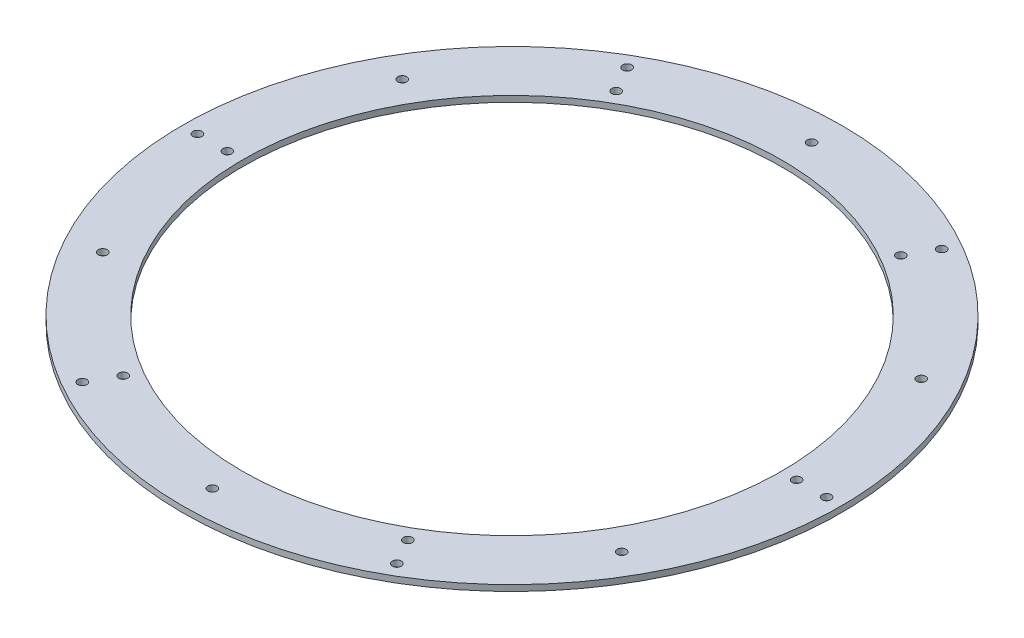
ISO-10303-21;
HEADER;
FILE_DESCRIPTION(('STEP AP214'),'2;1');
FILE_NAME('part.step','',(''),(''),'','','');
FILE_SCHEMA(('AUTOMOTIVE_DESIGN { 1 0 10303 214 1 1 1 1 }'));
ENDSEC;
DATA;
#1=APPLICATION_CONTEXT('core data for automotive mechanical design processes');
#2=APPLICATION_PROTOCOL_DEFINITION('international standard','automotive_design',2000,#1);
#3=PRODUCT_CONTEXT('',#1,'mechanical');
#4=PRODUCT('Part','Part','',(#3));
#5=PRODUCT_RELATED_PRODUCT_CATEGORY('part','',(#4));
#6=PRODUCT_DEFINITION_FORMATION('','',#4);
#7=PRODUCT_DEFINITION_CONTEXT('part definition',#1,'design');
#8=PRODUCT_DEFINITION('design','',#6,#7);
#9=PRODUCT_DEFINITION_SHAPE('','',#8);
#10=(LENGTH_UNIT() NAMED_UNIT(*) SI_UNIT(.MILLI.,.METRE.));
#11=(NAMED_UNIT(*) PLANE_ANGLE_UNIT() SI_UNIT($,.RADIAN.));
#12=(NAMED_UNIT(*) SI_UNIT($,.STERADIAN.) SOLID_ANGLE_UNIT());
#13=UNCERTAINTY_MEASURE_WITH_UNIT(LENGTH_MEASURE(1.E-05),#10,'distance_accuracy_value','');
#14=(GEOMETRIC_REPRESENTATION_CONTEXT(3) GLOBAL_UNCERTAINTY_ASSIGNED_CONTEXT((#13)) GLOBAL_UNIT_ASSIGNED_CONTEXT((#10,
#11,#12)) REPRESENTATION_CONTEXT('',''));
#15=CARTESIAN_POINT('',(0.,0.,0.));
#16=DIRECTION('',(0.,0.,1.));
#17=DIRECTION('',(1.,0.,0.));
#18=AXIS2_PLACEMENT_3D('',#15,#16,#17);
#19=CARTESIAN_POINT('',(0.,2.,0.));
#20=DIRECTION('',(0.,1.,0.));
#21=DIRECTION('',(0.,0.,1.));
#22=AXIS2_PLACEMENT_3D('',#19,#20,#21);
#23=PLANE('',#22);
#24=CARTESIAN_POINT('',(52.5,2.,-90.9326673973661));
#25=DIRECTION('',(0.,1.,0.));
#26=DIRECTION('',(0.,0.,1.));
#27=AXIS2_PLACEMENT_3D('',#24,#25,#26);
#28=CIRCLE('',#27,1.49999999999999);
#29=CARTESIAN_POINT('',(52.5,2.,-89.4326673973661));
#30=VERTEX_POINT('',#29);
#31=EDGE_CURVE('E142',#30,#30,#28,.T.);
#32=ORIENTED_EDGE('',*,*,#31,.F.);
#33=EDGE_LOOP('',(#32));
#34=FACE_BOUND('',#33,.T.);
#35=CARTESIAN_POINT('',(-86.6025403784439,2.,-50.));
#36=DIRECTION('',(0.,1.,0.));
#37=DIRECTION('',(0.,0.,1.));
#38=AXIS2_PLACEMENT_3D('',#35,#36,#37);
#39=CIRCLE('',#38,1.49999999999998);
#40=CARTESIAN_POINT('',(-86.6025403784439,2.,-48.5));
#41=VERTEX_POINT('',#40);
#42=EDGE_CURVE('E130',#41,#41,#39,.T.);
#43=ORIENTED_EDGE('',*,*,#42,.F.);
#44=EDGE_LOOP('',(#43));
#45=FACE_BOUND('',#44,.T.);
#46=CARTESIAN_POINT('',(-47.5,2.,-82.2724133595217));
#47=DIRECTION('',(0.,1.,0.));
#48=DIRECTION('',(0.,0.,1.));
#49=AXIS2_PLACEMENT_3D('',#46,#47,#48);
#50=CIRCLE('',#49,1.5);
#51=CARTESIAN_POINT('',(-47.5,2.,-80.7724133595217));
#52=VERTEX_POINT('',#51);
#53=EDGE_CURVE('E118',#52,#52,#50,.T.);
#54=ORIENTED_EDGE('',*,*,#53,.F.);
#55=EDGE_LOOP('',(#54));
#56=FACE_BOUND('',#55,.T.);
#57=CARTESIAN_POINT('',(-105.,2.,0.));
#58=DIRECTION('',(0.,1.,0.));
#59=DIRECTION('',(0.,0.,1.));
#60=AXIS2_PLACEMENT_3D('',#57,#58,#59);
#61=CIRCLE('',#60,1.49999999999998);
#62=CARTESIAN_POINT('',(-105.,2.,1.49999999999998));
#63=VERTEX_POINT('',#62);
#64=EDGE_CURVE('E106',#63,#63,#61,.T.);
#65=ORIENTED_EDGE('',*,*,#64,.F.);
#66=EDGE_LOOP('',(#65));
#67=FACE_BOUND('',#66,.T.);
#68=CARTESIAN_POINT('',(0.,2.,100.));
#69=DIRECTION('',(0.,1.,0.));
#70=DIRECTION('',(0.,0.,1.));
#71=AXIS2_PLACEMENT_3D('',#68,#69,#70);
#72=CIRCLE('',#71,1.5);
#73=CARTESIAN_POINT('',(0.,2.,101.5));
#74=VERTEX_POINT('',#73);
#75=EDGE_CURVE('E94',#74,#74,#72,.T.);
#76=ORIENTED_EDGE('',*,*,#75,.F.);
#77=EDGE_LOOP('',(#76));
#78=FACE_BOUND('',#77,.T.);
#79=CARTESIAN_POINT('',(-47.5,2.,82.2724133595217));
#80=DIRECTION('',(0.,1.,0.));
#81=DIRECTION('',(0.,0.,1.));
#82=AXIS2_PLACEMENT_3D('',#79,#80,#81);
#83=CIRCLE('',#82,1.5);
#84=CARTESIAN_POINT('',(-47.5,2.,83.7724133595217));
#85=VERTEX_POINT('',#84);
#86=EDGE_CURVE('E82',#85,#85,#83,.T.);
#87=ORIENTED_EDGE('',*,*,#86,.F.);
#88=EDGE_LOOP('',(#87));
#89=FACE_BOUND('',#88,.T.);
#90=CARTESIAN_POINT('',(52.5,2.,90.932667397366));
#91=DIRECTION('',(0.,1.,0.));
#92=DIRECTION('',(0.,0.,1.));
#93=AXIS2_PLACEMENT_3D('',#90,#91,#92);
#94=CIRCLE('',#93,1.5);
#95=CARTESIAN_POINT('',(52.5,2.,92.432667397366));
#96=VERTEX_POINT('',#95);
#97=EDGE_CURVE('E70',#96,#96,#94,.T.);
#98=ORIENTED_EDGE('',*,*,#97,.F.);
#99=EDGE_LOOP('',(#98));
#100=FACE_BOUND('',#99,.T.);
#101=CARTESIAN_POINT('',(86.6025403784439,2.,-50.));
#102=DIRECTION('',(0.,1.,0.));
#103=DIRECTION('',(0.,0.,1.));
#104=AXIS2_PLACEMENT_3D('',#101,#102,#103);
#105=CIRCLE('',#104,1.5);
#106=CARTESIAN_POINT('',(86.6025403784439,2.,-48.5));
#107=VERTEX_POINT('',#106);
#108=EDGE_CURVE('E58',#107,#107,#105,.T.);
#109=ORIENTED_EDGE('',*,*,#108,.F.);
#110=EDGE_LOOP('',(#109));
#111=FACE_BOUND('',#110,.T.);
#112=CARTESIAN_POINT('',(95.,2.,0.));
#113=DIRECTION('',(0.,1.,0.));
#114=DIRECTION('',(0.,0.,1.));
#115=AXIS2_PLACEMENT_3D('',#112,#113,#114);
#116=CIRCLE('',#115,1.5);
#117=CARTESIAN_POINT('',(95.,2.,1.5));
#118=VERTEX_POINT('',#117);
#119=EDGE_CURVE('E46',#118,#118,#116,.T.);
#120=ORIENTED_EDGE('',*,*,#119,.F.);
#121=EDGE_LOOP('',(#120));
#122=FACE_BOUND('',#121,.T.);
#123=CARTESIAN_POINT('',(0.,2.,0.));
#124=DIRECTION('',(0.,1.,0.));
#125=DIRECTION('',(0.,0.,1.));
#126=AXIS2_PLACEMENT_3D('',#123,#124,#125);
#127=CIRCLE('',#126,110.);
#128=CARTESIAN_POINT('',(0.,2.,110.));
#129=VERTEX_POINT('',#128);
#130=EDGE_CURVE('E10',#129,#129,#127,.T.);
#131=ORIENTED_EDGE('',*,*,#130,.T.);
#132=EDGE_LOOP('',(#131));
#133=FACE_BOUND('',#132,.T.);
#134=CARTESIAN_POINT('',(0.,2.,0.));
#135=DIRECTION('',(0.,1.,0.));
#136=DIRECTION('',(0.,0.,1.));
#137=AXIS2_PLACEMENT_3D('',#134,#135,#136);
#138=CIRCLE('',#137,90.);
#139=CARTESIAN_POINT('',(0.,2.,90.));
#140=VERTEX_POINT('',#139);
#141=EDGE_CURVE('E41',#140,#140,#138,.T.);
#142=ORIENTED_EDGE('',*,*,#141,.F.);
#143=EDGE_LOOP('',(#142));
#144=FACE_BOUND('',#143,.T.);
#145=CARTESIAN_POINT('',(105.,2.,0.));
#146=DIRECTION('',(0.,1.,0.));
#147=DIRECTION('',(0.,0.,1.));
#148=AXIS2_PLACEMENT_3D('',#145,#146,#147);
#149=CIRCLE('',#148,1.5);
#150=CARTESIAN_POINT('',(105.,2.,1.5));
#151=VERTEX_POINT('',#150);
#152=EDGE_CURVE('E52',#151,#151,#149,.T.);
#153=ORIENTED_EDGE('',*,*,#152,.F.);
#154=EDGE_LOOP('',(#153));
#155=FACE_BOUND('',#154,.T.);
#156=CARTESIAN_POINT('',(47.5,2.,82.2724133595217));
#157=DIRECTION('',(0.,1.,0.));
#158=DIRECTION('',(0.,0.,1.));
#159=AXIS2_PLACEMENT_3D('',#156,#157,#158);
#160=CIRCLE('',#159,1.5);
#161=CARTESIAN_POINT('',(47.5,2.,83.7724133595217));
#162=VERTEX_POINT('',#161);
#163=EDGE_CURVE('E64',#162,#162,#160,.T.);
#164=ORIENTED_EDGE('',*,*,#163,.F.);
#165=EDGE_LOOP('',(#164));
#166=FACE_BOUND('',#165,.T.);
#167=CARTESIAN_POINT('',(86.6025403784439,2.,50.));
#168=DIRECTION('',(0.,1.,0.));
#169=DIRECTION('',(0.,0.,1.));
#170=AXIS2_PLACEMENT_3D('',#167,#168,#169);
#171=CIRCLE('',#170,1.5);
#172=CARTESIAN_POINT('',(86.6025403784439,2.,51.5));
#173=VERTEX_POINT('',#172);
#174=EDGE_CURVE('E76',#173,#173,#171,.T.);
#175=ORIENTED_EDGE('',*,*,#174,.F.);
#176=EDGE_LOOP('',(#175));
#177=FACE_BOUND('',#176,.T.);
#178=CARTESIAN_POINT('',(-52.5,2.,90.932667397366));
#179=DIRECTION('',(0.,1.,0.));
#180=DIRECTION('',(0.,0.,1.));
#181=AXIS2_PLACEMENT_3D('',#178,#179,#180);
#182=CIRCLE('',#181,1.49999999999999);
#183=CARTESIAN_POINT('',(-52.5,2.,92.432667397366));
#184=VERTEX_POINT('',#183);
#185=EDGE_CURVE('E88',#184,#184,#182,.T.);
#186=ORIENTED_EDGE('',*,*,#185,.F.);
#187=EDGE_LOOP('',(#186));
#188=FACE_BOUND('',#187,.T.);
#189=CARTESIAN_POINT('',(-95.,2.,0.));
#190=DIRECTION('',(0.,1.,0.));
#191=DIRECTION('',(0.,0.,1.));
#192=AXIS2_PLACEMENT_3D('',#189,#190,#191);
#193=CIRCLE('',#192,1.5);
#194=CARTESIAN_POINT('',(-95.,2.,1.49999999999999));
#195=VERTEX_POINT('',#194);
#196=EDGE_CURVE('E100',#195,#195,#193,.T.);
#197=ORIENTED_EDGE('',*,*,#196,.F.);
#198=EDGE_LOOP('',(#197));
#199=FACE_BOUND('',#198,.T.);
#200=CARTESIAN_POINT('',(-86.6025403784439,2.,50.));
#201=DIRECTION('',(0.,1.,0.));
#202=DIRECTION('',(0.,0.,1.));
#203=AXIS2_PLACEMENT_3D('',#200,#201,#202);
#204=CIRCLE('',#203,1.49999999999998);
#205=CARTESIAN_POINT('',(-86.6025403784439,2.,51.5));
#206=VERTEX_POINT('',#205);
#207=EDGE_CURVE('E112',#206,#206,#204,.T.);
#208=ORIENTED_EDGE('',*,*,#207,.F.);
#209=EDGE_LOOP('',(#208));
#210=FACE_BOUND('',#209,.T.);
#211=CARTESIAN_POINT('',(-52.5,2.,-90.932667397366));
#212=DIRECTION('',(0.,1.,0.));
#213=DIRECTION('',(0.,0.,1.));
#214=AXIS2_PLACEMENT_3D('',#211,#212,#213);
#215=CIRCLE('',#214,1.5);
#216=CARTESIAN_POINT('',(-52.5,2.,-89.432667397366));
#217=VERTEX_POINT('',#216);
#218=EDGE_CURVE('E124',#217,#217,#215,.T.);
#219=ORIENTED_EDGE('',*,*,#218,.F.);
#220=EDGE_LOOP('',(#219));
#221=FACE_BOUND('',#220,.T.);
#222=CARTESIAN_POINT('',(47.5,2.,-82.2724133595217));
#223=DIRECTION('',(0.,1.,0.));
#224=DIRECTION('',(0.,0.,1.));
#225=AXIS2_PLACEMENT_3D('',#222,#223,#224);
#226=CIRCLE('',#225,1.5);
#227=CARTESIAN_POINT('',(47.5,2.,-80.7724133595217));
#228=VERTEX_POINT('',#227);
#229=EDGE_CURVE('E136',#228,#228,#226,.T.);
#230=ORIENTED_EDGE('',*,*,#229,.F.);
#231=EDGE_LOOP('',(#230));
#232=FACE_BOUND('',#231,.T.);
#233=CARTESIAN_POINT('',(0.,2.,-100.));
#234=DIRECTION('',(0.,1.,0.));
#235=DIRECTION('',(0.,0.,1.));
#236=AXIS2_PLACEMENT_3D('',#233,#234,#235);
#237=CIRCLE('',#236,1.5);
#238=CARTESIAN_POINT('',(0.,2.,-98.5));
#239=VERTEX_POINT('',#238);
#240=EDGE_CURVE('E148',#239,#239,#237,.T.);
#241=ORIENTED_EDGE('',*,*,#240,.F.);
#242=EDGE_LOOP('',(#241));
#243=FACE_BOUND('',#242,.T.);
#244=ADVANCED_FACE('F30',(#34,#45,#56,#67,#78,#89,#100,#111,#122,#133,#144,#155,#166,#177,#188,
#199,#210,#221,#232,#243),#23,.T.);
#245=CARTESIAN_POINT('',(0.,0.,0.));
#246=DIRECTION('',(0.,1.,0.));
#247=DIRECTION('',(0.,0.,1.));
#248=AXIS2_PLACEMENT_3D('',#245,#246,#247);
#249=PLANE('',#248);
#250=CARTESIAN_POINT('',(0.,0.,0.));
#251=DIRECTION('',(0.,1.,0.));
#252=DIRECTION('',(0.,0.,1.));
#253=AXIS2_PLACEMENT_3D('',#250,#251,#252);
#254=CIRCLE('',#253,110.);
#255=CARTESIAN_POINT('',(0.,0.,110.));
#256=VERTEX_POINT('',#255);
#257=EDGE_CURVE('E34',#256,#256,#254,.T.);
#258=ORIENTED_EDGE('',*,*,#257,.F.);
#259=EDGE_LOOP('',(#258));
#260=FACE_BOUND('',#259,.T.);
#261=CARTESIAN_POINT('',(0.,0.,0.));
#262=DIRECTION('',(0.,1.,0.));
#263=DIRECTION('',(0.,0.,1.));
#264=AXIS2_PLACEMENT_3D('',#261,#262,#263);
#265=CIRCLE('',#264,90.);
#266=CARTESIAN_POINT('',(0.,0.,90.));
#267=VERTEX_POINT('',#266);
#268=EDGE_CURVE('E43',#267,#267,#265,.T.);
#269=ORIENTED_EDGE('',*,*,#268,.T.);
#270=EDGE_LOOP('',(#269));
#271=FACE_BOUND('',#270,.T.);
#272=CARTESIAN_POINT('',(95.,0.,0.));
#273=DIRECTION('',(0.,1.,0.));
#274=DIRECTION('',(0.,0.,1.));
#275=AXIS2_PLACEMENT_3D('',#272,#273,#274);
#276=CIRCLE('',#275,1.5);
#277=CARTESIAN_POINT('',(95.,0.,1.5));
#278=VERTEX_POINT('',#277);
#279=EDGE_CURVE('E49',#278,#278,#276,.T.);
#280=ORIENTED_EDGE('',*,*,#279,.T.);
#281=EDGE_LOOP('',(#280));
#282=FACE_BOUND('',#281,.T.);
#283=CARTESIAN_POINT('',(105.,0.,0.));
#284=DIRECTION('',(0.,1.,0.));
#285=DIRECTION('',(0.,0.,1.));
#286=AXIS2_PLACEMENT_3D('',#283,#284,#285);
#287=CIRCLE('',#286,1.5);
#288=CARTESIAN_POINT('',(105.,0.,1.5));
#289=VERTEX_POINT('',#288);
#290=EDGE_CURVE('E55',#289,#289,#287,.T.);
#291=ORIENTED_EDGE('',*,*,#290,.T.);
#292=EDGE_LOOP('',(#291));
#293=FACE_BOUND('',#292,.T.);
#294=CARTESIAN_POINT('',(86.6025403784439,0.,-50.));
#295=DIRECTION('',(0.,1.,0.));
#296=DIRECTION('',(0.,0.,1.));
#297=AXIS2_PLACEMENT_3D('',#294,#295,#296);
#298=CIRCLE('',#297,1.5);
#299=CARTESIAN_POINT('',(86.6025403784439,0.,-48.5));
#300=VERTEX_POINT('',#299);
#301=EDGE_CURVE('E61',#300,#300,#298,.T.);
#302=ORIENTED_EDGE('',*,*,#301,.T.);
#303=EDGE_LOOP('',(#302));
#304=FACE_BOUND('',#303,.T.);
#305=CARTESIAN_POINT('',(47.5,0.,82.2724133595217));
#306=DIRECTION('',(0.,1.,0.));
#307=DIRECTION('',(0.,0.,1.));
#308=AXIS2_PLACEMENT_3D('',#305,#306,#307);
#309=CIRCLE('',#308,1.5);
#310=CARTESIAN_POINT('',(47.5,0.,83.7724133595217));
#311=VERTEX_POINT('',#310);
#312=EDGE_CURVE('E67',#311,#311,#309,.T.);
#313=ORIENTED_EDGE('',*,*,#312,.T.);
#314=EDGE_LOOP('',(#313));
#315=FACE_BOUND('',#314,.T.);
#316=CARTESIAN_POINT('',(52.5,0.,90.932667397366));
#317=DIRECTION('',(0.,1.,0.));
#318=DIRECTION('',(0.,0.,1.));
#319=AXIS2_PLACEMENT_3D('',#316,#317,#318);
#320=CIRCLE('',#319,1.5);
#321=CARTESIAN_POINT('',(52.5,0.,92.432667397366));
#322=VERTEX_POINT('',#321);
#323=EDGE_CURVE('E73',#322,#322,#320,.T.);
#324=ORIENTED_EDGE('',*,*,#323,.T.);
#325=EDGE_LOOP('',(#324));
#326=FACE_BOUND('',#325,.T.);
#327=CARTESIAN_POINT('',(86.6025403784439,0.,50.));
#328=DIRECTION('',(0.,1.,0.));
#329=DIRECTION('',(0.,0.,1.));
#330=AXIS2_PLACEMENT_3D('',#327,#328,#329);
#331=CIRCLE('',#330,1.5);
#332=CARTESIAN_POINT('',(86.6025403784439,0.,51.5));
#333=VERTEX_POINT('',#332);
#334=EDGE_CURVE('E79',#333,#333,#331,.T.);
#335=ORIENTED_EDGE('',*,*,#334,.T.);
#336=EDGE_LOOP('',(#335));
#337=FACE_BOUND('',#336,.T.);
#338=CARTESIAN_POINT('',(-47.5,0.,82.2724133595217));
#339=DIRECTION('',(0.,1.,0.));
#340=DIRECTION('',(0.,0.,1.));
#341=AXIS2_PLACEMENT_3D('',#338,#339,#340);
#342=CIRCLE('',#341,1.5);
#343=CARTESIAN_POINT('',(-47.5,0.,83.7724133595217));
#344=VERTEX_POINT('',#343);
#345=EDGE_CURVE('E85',#344,#344,#342,.T.);
#346=ORIENTED_EDGE('',*,*,#345,.T.);
#347=EDGE_LOOP('',(#346));
#348=FACE_BOUND('',#347,.T.);
#349=CARTESIAN_POINT('',(-52.5,0.,90.932667397366));
#350=DIRECTION('',(0.,1.,0.));
#351=DIRECTION('',(0.,0.,1.));
#352=AXIS2_PLACEMENT_3D('',#349,#350,#351);
#353=CIRCLE('',#352,1.49999999999999);
#354=CARTESIAN_POINT('',(-52.5,0.,92.432667397366));
#355=VERTEX_POINT('',#354);
#356=EDGE_CURVE('E91',#355,#355,#353,.T.);
#357=ORIENTED_EDGE('',*,*,#356,.T.);
#358=EDGE_LOOP('',(#357));
#359=FACE_BOUND('',#358,.T.);
#360=CARTESIAN_POINT('',(0.,0.,100.));
#361=DIRECTION('',(0.,1.,0.));
#362=DIRECTION('',(0.,0.,1.));
#363=AXIS2_PLACEMENT_3D('',#360,#361,#362);
#364=CIRCLE('',#363,1.5);
#365=CARTESIAN_POINT('',(0.,0.,101.5));
#366=VERTEX_POINT('',#365);
#367=EDGE_CURVE('E97',#366,#366,#364,.T.);
#368=ORIENTED_EDGE('',*,*,#367,.T.);
#369=EDGE_LOOP('',(#368));
#370=FACE_BOUND('',#369,.T.);
#371=CARTESIAN_POINT('',(-95.,0.,0.));
#372=DIRECTION('',(0.,1.,0.));
#373=DIRECTION('',(0.,0.,1.));
#374=AXIS2_PLACEMENT_3D('',#371,#372,#373);
#375=CIRCLE('',#374,1.5);
#376=CARTESIAN_POINT('',(-95.,0.,1.49999999999999));
#377=VERTEX_POINT('',#376);
#378=EDGE_CURVE('E103',#377,#377,#375,.T.);
#379=ORIENTED_EDGE('',*,*,#378,.T.);
#380=EDGE_LOOP('',(#379));
#381=FACE_BOUND('',#380,.T.);
#382=CARTESIAN_POINT('',(-105.,0.,0.));
#383=DIRECTION('',(0.,1.,0.));
#384=DIRECTION('',(0.,0.,1.));
#385=AXIS2_PLACEMENT_3D('',#382,#383,#384);
#386=CIRCLE('',#385,1.49999999999998);
#387=CARTESIAN_POINT('',(-105.,0.,1.49999999999998));
#388=VERTEX_POINT('',#387);
#389=EDGE_CURVE('E109',#388,#388,#386,.T.);
#390=ORIENTED_EDGE('',*,*,#389,.T.);
#391=EDGE_LOOP('',(#390));
#392=FACE_BOUND('',#391,.T.);
#393=CARTESIAN_POINT('',(-86.6025403784439,0.,50.));
#394=DIRECTION('',(0.,1.,0.));
#395=DIRECTION('',(0.,0.,1.));
#396=AXIS2_PLACEMENT_3D('',#393,#394,#395);
#397=CIRCLE('',#396,1.49999999999998);
#398=CARTESIAN_POINT('',(-86.6025403784439,0.,51.5));
#399=VERTEX_POINT('',#398);
#400=EDGE_CURVE('E115',#399,#399,#397,.T.);
#401=ORIENTED_EDGE('',*,*,#400,.T.);
#402=EDGE_LOOP('',(#401));
#403=FACE_BOUND('',#402,.T.);
#404=CARTESIAN_POINT('',(-47.5,0.,-82.2724133595217));
#405=DIRECTION('',(0.,1.,0.));
#406=DIRECTION('',(0.,0.,1.));
#407=AXIS2_PLACEMENT_3D('',#404,#405,#406);
#408=CIRCLE('',#407,1.5);
#409=CARTESIAN_POINT('',(-47.5,0.,-80.7724133595217));
#410=VERTEX_POINT('',#409);
#411=EDGE_CURVE('E121',#410,#410,#408,.T.);
#412=ORIENTED_EDGE('',*,*,#411,.T.);
#413=EDGE_LOOP('',(#412));
#414=FACE_BOUND('',#413,.T.);
#415=CARTESIAN_POINT('',(-52.5,0.,-90.932667397366));
#416=DIRECTION('',(0.,1.,0.));
#417=DIRECTION('',(0.,0.,1.));
#418=AXIS2_PLACEMENT_3D('',#415,#416,#417);
#419=CIRCLE('',#418,1.5);
#420=CARTESIAN_POINT('',(-52.5,0.,-89.432667397366));
#421=VERTEX_POINT('',#420);
#422=EDGE_CURVE('E127',#421,#421,#419,.T.);
#423=ORIENTED_EDGE('',*,*,#422,.T.);
#424=EDGE_LOOP('',(#423));
#425=FACE_BOUND('',#424,.T.);
#426=CARTESIAN_POINT('',(-86.6025403784439,0.,-50.));
#427=DIRECTION('',(0.,1.,0.));
#428=DIRECTION('',(0.,0.,1.));
#429=AXIS2_PLACEMENT_3D('',#426,#427,#428);
#430=CIRCLE('',#429,1.49999999999998);
#431=CARTESIAN_POINT('',(-86.6025403784439,0.,-48.5));
#432=VERTEX_POINT('',#431);
#433=EDGE_CURVE('E133',#432,#432,#430,.T.);
#434=ORIENTED_EDGE('',*,*,#433,.T.);
#435=EDGE_LOOP('',(#434));
#436=FACE_BOUND('',#435,.T.);
#437=CARTESIAN_POINT('',(47.5,0.,-82.2724133595217));
#438=DIRECTION('',(0.,1.,0.));
#439=DIRECTION('',(0.,0.,1.));
#440=AXIS2_PLACEMENT_3D('',#437,#438,#439);
#441=CIRCLE('',#440,1.5);
#442=CARTESIAN_POINT('',(47.5,0.,-80.7724133595217));
#443=VERTEX_POINT('',#442);
#444=EDGE_CURVE('E139',#443,#443,#441,.T.);
#445=ORIENTED_EDGE('',*,*,#444,.T.);
#446=EDGE_LOOP('',(#445));
#447=FACE_BOUND('',#446,.T.);
#448=CARTESIAN_POINT('',(52.5,0.,-90.9326673973661));
#449=DIRECTION('',(0.,1.,0.));
#450=DIRECTION('',(0.,0.,1.));
#451=AXIS2_PLACEMENT_3D('',#448,#449,#450);
#452=CIRCLE('',#451,1.49999999999999);
#453=CARTESIAN_POINT('',(52.5,0.,-89.4326673973661));
#454=VERTEX_POINT('',#453);
#455=EDGE_CURVE('E145',#454,#454,#452,.T.);
#456=ORIENTED_EDGE('',*,*,#455,.T.);
#457=EDGE_LOOP('',(#456));
#458=FACE_BOUND('',#457,.T.);
#459=CARTESIAN_POINT('',(0.,0.,-100.));
#460=DIRECTION('',(0.,1.,0.));
#461=DIRECTION('',(0.,0.,1.));
#462=AXIS2_PLACEMENT_3D('',#459,#460,#461);
#463=CIRCLE('',#462,1.5);
#464=CARTESIAN_POINT('',(0.,0.,-98.5));
#465=VERTEX_POINT('',#464);
#466=EDGE_CURVE('E151',#465,#465,#463,.T.);
#467=ORIENTED_EDGE('',*,*,#466,.T.);
#468=EDGE_LOOP('',(#467));
#469=FACE_BOUND('',#468,.T.);
#470=ADVANCED_FACE('F161',(#260,#271,#282,#293,#304,#315,#326,#337,#348,#359,#370,#381,#392,
#403,#414,#425,#436,#447,#458,#469),#249,.F.);
#471=CARTESIAN_POINT('',(0.,2.,0.));
#472=DIRECTION('',(0.,-1.,0.));
#473=DIRECTION('',(0.,0.,-1.));
#474=AXIS2_PLACEMENT_3D('',#471,#472,#473);
#475=CYLINDRICAL_SURFACE('',#474,110.);
#476=ORIENTED_EDGE('',*,*,#130,.F.);
#477=EDGE_LOOP('',(#476));
#478=FACE_BOUND('',#477,.T.);
#479=ORIENTED_EDGE('',*,*,#257,.T.);
#480=EDGE_LOOP('',(#479));
#481=FACE_BOUND('',#480,.T.);
#482=ADVANCED_FACE('F32',(#478,#481),#475,.T.);
#483=CARTESIAN_POINT('',(0.,2.,0.));
#484=DIRECTION('',(0.,-1.,0.));
#485=DIRECTION('',(0.,0.,-1.));
#486=AXIS2_PLACEMENT_3D('',#483,#484,#485);
#487=CYLINDRICAL_SURFACE('',#486,90.);
#488=ORIENTED_EDGE('',*,*,#141,.T.);
#489=EDGE_LOOP('',(#488));
#490=FACE_BOUND('',#489,.T.);
#491=ORIENTED_EDGE('',*,*,#268,.F.);
#492=EDGE_LOOP('',(#491));
#493=FACE_BOUND('',#492,.T.);
#494=ADVANCED_FACE('F171',(#490,#493),#487,.F.);
#495=CARTESIAN_POINT('',(95.,2.,0.));
#496=DIRECTION('',(0.,-1.,0.));
#497=DIRECTION('',(0.,0.,-1.));
#498=AXIS2_PLACEMENT_3D('',#495,#496,#497);
#499=CYLINDRICAL_SURFACE('',#498,1.5);
#500=ORIENTED_EDGE('',*,*,#119,.T.);
#501=EDGE_LOOP('',(#500));
#502=FACE_BOUND('',#501,.T.);
#503=ORIENTED_EDGE('',*,*,#279,.F.);
#504=EDGE_LOOP('',(#503));
#505=FACE_BOUND('',#504,.T.);
#506=ADVANCED_FACE('F174',(#502,#505),#499,.F.);
#507=CARTESIAN_POINT('',(105.,2.,0.));
#508=DIRECTION('',(0.,-1.,0.));
#509=DIRECTION('',(0.,0.,-1.));
#510=AXIS2_PLACEMENT_3D('',#507,#508,#509);
#511=CYLINDRICAL_SURFACE('',#510,1.5);
#512=ORIENTED_EDGE('',*,*,#152,.T.);
#513=EDGE_LOOP('',(#512));
#514=FACE_BOUND('',#513,.T.);
#515=ORIENTED_EDGE('',*,*,#290,.F.);
#516=EDGE_LOOP('',(#515));
#517=FACE_BOUND('',#516,.T.);
#518=ADVANCED_FACE('F178',(#514,#517),#511,.F.);
#519=CARTESIAN_POINT('',(86.6025403784439,2.,-50.));
#520=DIRECTION('',(0.,-1.,0.));
#521=DIRECTION('',(0.,0.,-1.));
#522=AXIS2_PLACEMENT_3D('',#519,#520,#521);
#523=CYLINDRICAL_SURFACE('',#522,1.5);
#524=ORIENTED_EDGE('',*,*,#108,.T.);
#525=EDGE_LOOP('',(#524));
#526=FACE_BOUND('',#525,.T.);
#527=ORIENTED_EDGE('',*,*,#301,.F.);
#528=EDGE_LOOP('',(#527));
#529=FACE_BOUND('',#528,.T.);
#530=ADVANCED_FACE('F182',(#526,#529),#523,.F.);
#531=CARTESIAN_POINT('',(47.5,2.,82.2724133595217));
#532=DIRECTION('',(0.,-1.,0.));
#533=DIRECTION('',(0.,0.,-1.));
#534=AXIS2_PLACEMENT_3D('',#531,#532,#533);
#535=CYLINDRICAL_SURFACE('',#534,1.5);
#536=ORIENTED_EDGE('',*,*,#163,.T.);
#537=EDGE_LOOP('',(#536));
#538=FACE_BOUND('',#537,.T.);
#539=ORIENTED_EDGE('',*,*,#312,.F.);
#540=EDGE_LOOP('',(#539));
#541=FACE_BOUND('',#540,.T.);
#542=ADVANCED_FACE('F186',(#538,#541),#535,.F.);
#543=CARTESIAN_POINT('',(52.5,2.,90.932667397366));
#544=DIRECTION('',(0.,-1.,0.));
#545=DIRECTION('',(0.,0.,-1.));
#546=AXIS2_PLACEMENT_3D('',#543,#544,#545);
#547=CYLINDRICAL_SURFACE('',#546,1.5);
#548=ORIENTED_EDGE('',*,*,#97,.T.);
#549=EDGE_LOOP('',(#548));
#550=FACE_BOUND('',#549,.T.);
#551=ORIENTED_EDGE('',*,*,#323,.F.);
#552=EDGE_LOOP('',(#551));
#553=FACE_BOUND('',#552,.T.);
#554=ADVANCED_FACE('F190',(#550,#553),#547,.F.);
#555=CARTESIAN_POINT('',(86.6025403784439,2.,50.));
#556=DIRECTION('',(0.,-1.,0.));
#557=DIRECTION('',(0.,0.,-1.));
#558=AXIS2_PLACEMENT_3D('',#555,#556,#557);
#559=CYLINDRICAL_SURFACE('',#558,1.5);
#560=ORIENTED_EDGE('',*,*,#174,.T.);
#561=EDGE_LOOP('',(#560));
#562=FACE_BOUND('',#561,.T.);
#563=ORIENTED_EDGE('',*,*,#334,.F.);
#564=EDGE_LOOP('',(#563));
#565=FACE_BOUND('',#564,.T.);
#566=ADVANCED_FACE('F194',(#562,#565),#559,.F.);
#567=CARTESIAN_POINT('',(-47.5,2.,82.2724133595217));
#568=DIRECTION('',(0.,-1.,0.));
#569=DIRECTION('',(0.,0.,-1.));
#570=AXIS2_PLACEMENT_3D('',#567,#568,#569);
#571=CYLINDRICAL_SURFACE('',#570,1.5);
#572=ORIENTED_EDGE('',*,*,#86,.T.);
#573=EDGE_LOOP('',(#572));
#574=FACE_BOUND('',#573,.T.);
#575=ORIENTED_EDGE('',*,*,#345,.F.);
#576=EDGE_LOOP('',(#575));
#577=FACE_BOUND('',#576,.T.);
#578=ADVANCED_FACE('F198',(#574,#577),#571,.F.);
#579=CARTESIAN_POINT('',(-52.5,2.,90.932667397366));
#580=DIRECTION('',(0.,-1.,0.));
#581=DIRECTION('',(0.,0.,-1.));
#582=AXIS2_PLACEMENT_3D('',#579,#580,#581);
#583=CYLINDRICAL_SURFACE('',#582,1.49999999999999);
#584=ORIENTED_EDGE('',*,*,#185,.T.);
#585=EDGE_LOOP('',(#584));
#586=FACE_BOUND('',#585,.T.);
#587=ORIENTED_EDGE('',*,*,#356,.F.);
#588=EDGE_LOOP('',(#587));
#589=FACE_BOUND('',#588,.T.);
#590=ADVANCED_FACE('F202',(#586,#589),#583,.F.);
#591=CARTESIAN_POINT('',(0.,2.,100.));
#592=DIRECTION('',(0.,-1.,0.));
#593=DIRECTION('',(0.,0.,-1.));
#594=AXIS2_PLACEMENT_3D('',#591,#592,#593);
#595=CYLINDRICAL_SURFACE('',#594,1.5);
#596=ORIENTED_EDGE('',*,*,#75,.T.);
#597=EDGE_LOOP('',(#596));
#598=FACE_BOUND('',#597,.T.);
#599=ORIENTED_EDGE('',*,*,#367,.F.);
#600=EDGE_LOOP('',(#599));
#601=FACE_BOUND('',#600,.T.);
#602=ADVANCED_FACE('F206',(#598,#601),#595,.F.);
#603=CARTESIAN_POINT('',(-95.,2.,0.));
#604=DIRECTION('',(0.,-1.,0.));
#605=DIRECTION('',(0.,0.,-1.));
#606=AXIS2_PLACEMENT_3D('',#603,#604,#605);
#607=CYLINDRICAL_SURFACE('',#606,1.5);
#608=ORIENTED_EDGE('',*,*,#196,.T.);
#609=EDGE_LOOP('',(#608));
#610=FACE_BOUND('',#609,.T.);
#611=ORIENTED_EDGE('',*,*,#378,.F.);
#612=EDGE_LOOP('',(#611));
#613=FACE_BOUND('',#612,.T.);
#614=ADVANCED_FACE('F210',(#610,#613),#607,.F.);
#615=CARTESIAN_POINT('',(-105.,2.,0.));
#616=DIRECTION('',(0.,-1.,0.));
#617=DIRECTION('',(0.,0.,-1.));
#618=AXIS2_PLACEMENT_3D('',#615,#616,#617);
#619=CYLINDRICAL_SURFACE('',#618,1.49999999999998);
#620=ORIENTED_EDGE('',*,*,#64,.T.);
#621=EDGE_LOOP('',(#620));
#622=FACE_BOUND('',#621,.T.);
#623=ORIENTED_EDGE('',*,*,#389,.F.);
#624=EDGE_LOOP('',(#623));
#625=FACE_BOUND('',#624,.T.);
#626=ADVANCED_FACE('F214',(#622,#625),#619,.F.);
#627=CARTESIAN_POINT('',(-86.6025403784439,2.,50.));
#628=DIRECTION('',(0.,-1.,0.));
#629=DIRECTION('',(0.,0.,-1.));
#630=AXIS2_PLACEMENT_3D('',#627,#628,#629);
#631=CYLINDRICAL_SURFACE('',#630,1.49999999999998);
#632=ORIENTED_EDGE('',*,*,#207,.T.);
#633=EDGE_LOOP('',(#632));
#634=FACE_BOUND('',#633,.T.);
#635=ORIENTED_EDGE('',*,*,#400,.F.);
#636=EDGE_LOOP('',(#635));
#637=FACE_BOUND('',#636,.T.);
#638=ADVANCED_FACE('F218',(#634,#637),#631,.F.);
#639=CARTESIAN_POINT('',(-47.5,2.,-82.2724133595217));
#640=DIRECTION('',(0.,-1.,0.));
#641=DIRECTION('',(0.,0.,-1.));
#642=AXIS2_PLACEMENT_3D('',#639,#640,#641);
#643=CYLINDRICAL_SURFACE('',#642,1.5);
#644=ORIENTED_EDGE('',*,*,#53,.T.);
#645=EDGE_LOOP('',(#644));
#646=FACE_BOUND('',#645,.T.);
#647=ORIENTED_EDGE('',*,*,#411,.F.);
#648=EDGE_LOOP('',(#647));
#649=FACE_BOUND('',#648,.T.);
#650=ADVANCED_FACE('F222',(#646,#649),#643,.F.);
#651=CARTESIAN_POINT('',(-52.5,2.,-90.932667397366));
#652=DIRECTION('',(0.,-1.,0.));
#653=DIRECTION('',(0.,0.,-1.));
#654=AXIS2_PLACEMENT_3D('',#651,#652,#653);
#655=CYLINDRICAL_SURFACE('',#654,1.5);
#656=ORIENTED_EDGE('',*,*,#218,.T.);
#657=EDGE_LOOP('',(#656));
#658=FACE_BOUND('',#657,.T.);
#659=ORIENTED_EDGE('',*,*,#422,.F.);
#660=EDGE_LOOP('',(#659));
#661=FACE_BOUND('',#660,.T.);
#662=ADVANCED_FACE('F226',(#658,#661),#655,.F.);
#663=CARTESIAN_POINT('',(-86.6025403784439,2.,-50.));
#664=DIRECTION('',(0.,-1.,0.));
#665=DIRECTION('',(0.,0.,-1.));
#666=AXIS2_PLACEMENT_3D('',#663,#664,#665);
#667=CYLINDRICAL_SURFACE('',#666,1.49999999999998);
#668=ORIENTED_EDGE('',*,*,#42,.T.);
#669=EDGE_LOOP('',(#668));
#670=FACE_BOUND('',#669,.T.);
#671=ORIENTED_EDGE('',*,*,#433,.F.);
#672=EDGE_LOOP('',(#671));
#673=FACE_BOUND('',#672,.T.);
#674=ADVANCED_FACE('F230',(#670,#673),#667,.F.);
#675=CARTESIAN_POINT('',(47.5,2.,-82.2724133595217));
#676=DIRECTION('',(0.,-1.,0.));
#677=DIRECTION('',(0.,0.,-1.));
#678=AXIS2_PLACEMENT_3D('',#675,#676,#677);
#679=CYLINDRICAL_SURFACE('',#678,1.5);
#680=ORIENTED_EDGE('',*,*,#229,.T.);
#681=EDGE_LOOP('',(#680));
#682=FACE_BOUND('',#681,.T.);
#683=ORIENTED_EDGE('',*,*,#444,.F.);
#684=EDGE_LOOP('',(#683));
#685=FACE_BOUND('',#684,.T.);
#686=ADVANCED_FACE('F234',(#682,#685),#679,.F.);
#687=CARTESIAN_POINT('',(52.5,2.,-90.9326673973661));
#688=DIRECTION('',(0.,-1.,0.));
#689=DIRECTION('',(0.,0.,-1.));
#690=AXIS2_PLACEMENT_3D('',#687,#688,#689);
#691=CYLINDRICAL_SURFACE('',#690,1.49999999999999);
#692=ORIENTED_EDGE('',*,*,#31,.T.);
#693=EDGE_LOOP('',(#692));
#694=FACE_BOUND('',#693,.T.);
#695=ORIENTED_EDGE('',*,*,#455,.F.);
#696=EDGE_LOOP('',(#695));
#697=FACE_BOUND('',#696,.T.);
#698=ADVANCED_FACE('F238',(#694,#697),#691,.F.);
#699=CARTESIAN_POINT('',(0.,2.,-100.));
#700=DIRECTION('',(0.,-1.,0.));
#701=DIRECTION('',(0.,0.,-1.));
#702=AXIS2_PLACEMENT_3D('',#699,#700,#701);
#703=CYLINDRICAL_SURFACE('',#702,1.5);
#704=ORIENTED_EDGE('',*,*,#240,.T.);
#705=EDGE_LOOP('',(#704));
#706=FACE_BOUND('',#705,.T.);
#707=ORIENTED_EDGE('',*,*,#466,.F.);
#708=EDGE_LOOP('',(#707));
#709=FACE_BOUND('',#708,.T.);
#710=ADVANCED_FACE('F157',(#706,#709),#703,.F.);
#711=CLOSED_SHELL('',(#244,#470,#482,#494,#506,#518,#530,#542,#554,#566,#578,#590,#602,#614,
#626,#638,#650,#662,#674,#686,#698,#710));
#712=MANIFOLD_SOLID_BREP('B2',#711);
#713=ADVANCED_BREP_SHAPE_REPRESENTATION('',(#18,#712),#14);
#714=SHAPE_DEFINITION_REPRESENTATION(#9,#713);
ENDSEC;
END-ISO-10303-21;
